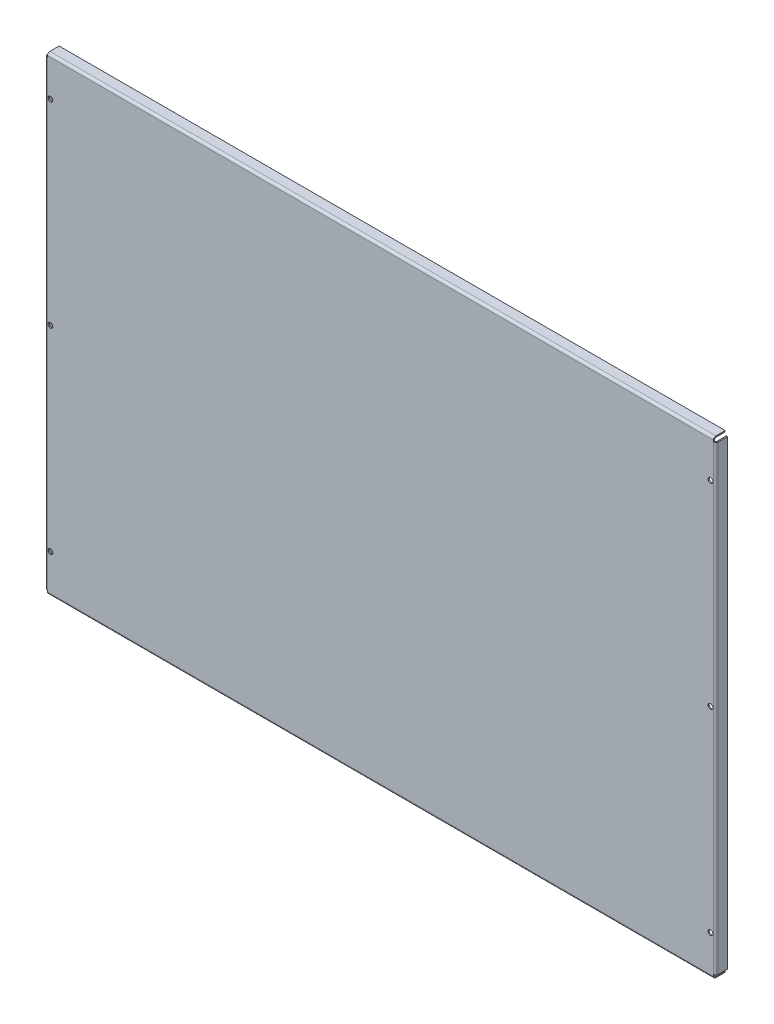
ISO-10303-21;
HEADER;
FILE_DESCRIPTION(('STEP AP214'),'2;1');
FILE_NAME('part.step','',(''),(''),'','','');
FILE_SCHEMA(('AUTOMOTIVE_DESIGN { 1 0 10303 214 1 1 1 1 }'));
ENDSEC;
DATA;
#1=APPLICATION_CONTEXT('core data for automotive mechanical design processes');
#2=APPLICATION_PROTOCOL_DEFINITION('international standard','automotive_design',2000,#1);
#3=PRODUCT_CONTEXT('',#1,'mechanical');
#4=PRODUCT('Part','Part','',(#3));
#5=PRODUCT_RELATED_PRODUCT_CATEGORY('part','',(#4));
#6=PRODUCT_DEFINITION_FORMATION('','',#4);
#7=PRODUCT_DEFINITION_CONTEXT('part definition',#1,'design');
#8=PRODUCT_DEFINITION('design','',#6,#7);
#9=PRODUCT_DEFINITION_SHAPE('','',#8);
#10=(LENGTH_UNIT() NAMED_UNIT(*) SI_UNIT(.MILLI.,.METRE.));
#11=(NAMED_UNIT(*) PLANE_ANGLE_UNIT() SI_UNIT($,.RADIAN.));
#12=(NAMED_UNIT(*) SI_UNIT($,.STERADIAN.) SOLID_ANGLE_UNIT());
#13=UNCERTAINTY_MEASURE_WITH_UNIT(LENGTH_MEASURE(1.E-05),#10,'distance_accuracy_value','');
#14=(GEOMETRIC_REPRESENTATION_CONTEXT(3) GLOBAL_UNCERTAINTY_ASSIGNED_CONTEXT((#13)) GLOBAL_UNIT_ASSIGNED_CONTEXT((#10,
#11,#12)) REPRESENTATION_CONTEXT('',''));
#15=CARTESIAN_POINT('',(0.,0.,0.));
#16=DIRECTION('',(0.,0.,1.));
#17=DIRECTION('',(1.,0.,0.));
#18=AXIS2_PLACEMENT_3D('',#15,#16,#17);
#19=CARTESIAN_POINT('',(539.877,380.238,-134.62));
#20=DIRECTION('',(-1.,0.,0.));
#21=DIRECTION('',(0.,0.,1.));
#22=AXIS2_PLACEMENT_3D('',#19,#20,#21);
#23=PLANE('',#22);
#24=DIRECTION('',(0.,0.,1.));
#25=VECTOR('',#24,1.);
#26=CARTESIAN_POINT('',(539.877,380.238,-134.62));
#27=LINE('',#26,#25);
#28=CARTESIAN_POINT('',(539.877,380.238,-19.05));
#29=VERTEX_POINT('',#28);
#30=CARTESIAN_POINT('',(539.877,380.238,-3.81000000000001));
#31=VERTEX_POINT('',#30);
#32=EDGE_CURVE('E643',#29,#31,#27,.T.);
#33=ORIENTED_EDGE('',*,*,#32,.T.);
#34=DIRECTION('',(0.,-1.,0.));
#35=VECTOR('',#34,1.);
#36=CARTESIAN_POINT('',(539.877,380.238,-3.81000000000001));
#37=LINE('',#36,#35);
#38=CARTESIAN_POINT('',(539.877,378.333,-3.81000000000001));
#39=VERTEX_POINT('',#38);
#40=EDGE_CURVE('E13',#31,#39,#37,.T.);
#41=ORIENTED_EDGE('',*,*,#40,.T.);
#42=DIRECTION('',(0.,0.,-1.));
#43=VECTOR('',#42,1.);
#44=CARTESIAN_POINT('',(539.877,378.333,1.23111397619545E-12));
#45=LINE('',#44,#43);
#46=CARTESIAN_POINT('',(539.877,378.333,-19.05));
#47=VERTEX_POINT('',#46);
#48=EDGE_CURVE('E147',#39,#47,#45,.T.);
#49=ORIENTED_EDGE('',*,*,#48,.T.);
#50=DIRECTION('',(0.,1.,0.));
#51=VECTOR('',#50,1.);
#52=CARTESIAN_POINT('',(539.877,380.238,-19.05));
#53=LINE('',#52,#51);
#54=EDGE_CURVE('E350',#47,#29,#53,.T.);
#55=ORIENTED_EDGE('',*,*,#54,.T.);
#56=EDGE_LOOP('',(#33,#41,#49,#55));
#57=FACE_BOUND('',#56,.T.);
#58=ADVANCED_FACE('F132',(#57),#23,.F.);
#59=CARTESIAN_POINT('',(-543.687,373.888,-134.62));
#60=DIRECTION('',(0.,-1.,0.));
#61=DIRECTION('',(0.,0.,-1.));
#62=AXIS2_PLACEMENT_3D('',#59,#60,#61);
#63=PLANE('',#62);
#64=DIRECTION('',(0.,0.,1.));
#65=VECTOR('',#64,1.);
#66=CARTESIAN_POINT('',(-543.687,373.888,-134.62));
#67=LINE('',#66,#65);
#68=CARTESIAN_POINT('',(-543.687,373.888,-19.05));
#69=VERTEX_POINT('',#68);
#70=CARTESIAN_POINT('',(-543.687,373.888,-3.81000000000009));
#71=VERTEX_POINT('',#70);
#72=EDGE_CURVE('E372',#69,#71,#67,.T.);
#73=ORIENTED_EDGE('',*,*,#72,.T.);
#74=DIRECTION('',(1.,0.,0.));
#75=VECTOR('',#74,1.);
#76=CARTESIAN_POINT('',(-543.687,373.888,-3.81000000000009));
#77=LINE('',#76,#75);
#78=CARTESIAN_POINT('',(-541.782,373.888,-3.81000000000009));
#79=VERTEX_POINT('',#78);
#80=EDGE_CURVE('E141',#71,#79,#77,.T.);
#81=ORIENTED_EDGE('',*,*,#80,.T.);
#82=DIRECTION('',(0.,0.,-1.));
#83=VECTOR('',#82,1.);
#84=CARTESIAN_POINT('',(-541.782,373.888,3.52064056920022E-12));
#85=LINE('',#84,#83);
#86=CARTESIAN_POINT('',(-541.782,373.888,-19.05));
#87=VERTEX_POINT('',#86);
#88=EDGE_CURVE('E155',#79,#87,#85,.T.);
#89=ORIENTED_EDGE('',*,*,#88,.T.);
#90=DIRECTION('',(-1.,0.,0.));
#91=VECTOR('',#90,1.);
#92=CARTESIAN_POINT('',(-543.687,373.888,-19.05));
#93=LINE('',#92,#91);
#94=EDGE_CURVE('E347',#87,#69,#93,.T.);
#95=ORIENTED_EDGE('',*,*,#94,.T.);
#96=EDGE_LOOP('',(#73,#81,#89,#95));
#97=FACE_BOUND('',#96,.T.);
#98=ADVANCED_FACE('F370',(#97),#63,.F.);
#99=CARTESIAN_POINT('',(-539.877,380.238,-134.62));
#100=DIRECTION('',(1.,0.,0.));
#101=DIRECTION('',(0.,0.,-1.));
#102=AXIS2_PLACEMENT_3D('',#99,#100,#101);
#103=PLANE('',#102);
#104=DIRECTION('',(0.,0.,1.));
#105=VECTOR('',#104,1.);
#106=CARTESIAN_POINT('',(-539.877,378.333,1.23111397619545E-12));
#107=LINE('',#106,#105);
#108=CARTESIAN_POINT('',(-539.877,378.333,-19.05));
#109=VERTEX_POINT('',#108);
#110=CARTESIAN_POINT('',(-539.877,378.333,-3.81000000000001));
#111=VERTEX_POINT('',#110);
#112=EDGE_CURVE('E588',#109,#111,#107,.T.);
#113=ORIENTED_EDGE('',*,*,#112,.T.);
#114=DIRECTION('',(-1.16558847729676E-13,1.,0.));
#115=VECTOR('',#114,1.);
#116=CARTESIAN_POINT('',(-539.877,378.333,-3.81000000000001));
#117=LINE('',#116,#115);
#118=CARTESIAN_POINT('',(-539.877,380.238,-3.81000000000001));
#119=VERTEX_POINT('',#118);
#120=EDGE_CURVE('E364',#111,#119,#117,.T.);
#121=ORIENTED_EDGE('',*,*,#120,.T.);
#122=DIRECTION('',(0.,0.,1.));
#123=VECTOR('',#122,1.);
#124=CARTESIAN_POINT('',(-539.877,380.238,-134.62));
#125=LINE('',#124,#123);
#126=CARTESIAN_POINT('',(-539.877,380.238,-19.05));
#127=VERTEX_POINT('',#126);
#128=EDGE_CURVE('E654',#127,#119,#125,.T.);
#129=ORIENTED_EDGE('',*,*,#128,.F.);
#130=DIRECTION('',(0.,-1.,0.));
#131=VECTOR('',#130,1.);
#132=CARTESIAN_POINT('',(-539.877,380.238,-19.05));
#133=LINE('',#132,#131);
#134=EDGE_CURVE('E592',#127,#109,#133,.T.);
#135=ORIENTED_EDGE('',*,*,#134,.T.);
#136=EDGE_LOOP('',(#113,#121,#129,#135));
#137=FACE_BOUND('',#136,.T.);
#138=ADVANCED_FACE('F791',(#137),#103,.F.);
#139=CARTESIAN_POINT('',(-539.877,-373.888,-134.62));
#140=DIRECTION('',(1.,0.,0.));
#141=DIRECTION('',(0.,0.,-1.));
#142=AXIS2_PLACEMENT_3D('',#139,#140,#141);
#143=PLANE('',#142);
#144=DIRECTION('',(0.,0.,1.));
#145=VECTOR('',#144,1.);
#146=CARTESIAN_POINT('',(-539.877,-380.238,-134.62));
#147=LINE('',#146,#145);
#148=CARTESIAN_POINT('',(-539.877,-380.238,-19.05));
#149=VERTEX_POINT('',#148);
#150=CARTESIAN_POINT('',(-539.877,-380.238,-3.80999999999998));
#151=VERTEX_POINT('',#150);
#152=EDGE_CURVE('E686',#149,#151,#147,.T.);
#153=ORIENTED_EDGE('',*,*,#152,.T.);
#154=DIRECTION('',(0.,1.,0.));
#155=VECTOR('',#154,1.);
#156=CARTESIAN_POINT('',(-539.877,-380.238,-3.80999999999998));
#157=LINE('',#156,#155);
#158=CARTESIAN_POINT('',(-539.877,-378.333,-3.80999999999998));
#159=VERTEX_POINT('',#158);
#160=EDGE_CURVE('E361',#151,#159,#157,.T.);
#161=ORIENTED_EDGE('',*,*,#160,.T.);
#162=DIRECTION('',(0.,0.,-1.));
#163=VECTOR('',#162,1.);
#164=CARTESIAN_POINT('',(-539.877,-378.333,1.23111397619545E-12));
#165=LINE('',#164,#163);
#166=CARTESIAN_POINT('',(-539.877,-378.333,-19.05));
#167=VERTEX_POINT('',#166);
#168=EDGE_CURVE('E711',#159,#167,#165,.T.);
#169=ORIENTED_EDGE('',*,*,#168,.T.);
#170=DIRECTION('',(0.,-1.,0.));
#171=VECTOR('',#170,1.);
#172=CARTESIAN_POINT('',(-539.877,-380.238,-19.05));
#173=LINE('',#172,#171);
#174=EDGE_CURVE('E337',#167,#149,#173,.T.);
#175=ORIENTED_EDGE('',*,*,#174,.T.);
#176=EDGE_LOOP('',(#153,#161,#169,#175));
#177=FACE_BOUND('',#176,.T.);
#178=ADVANCED_FACE('F773',(#177),#143,.F.);
#179=CARTESIAN_POINT('',(539.877,-373.888,-134.62));
#180=DIRECTION('',(0.,1.,0.));
#181=DIRECTION('',(0.,0.,1.));
#182=AXIS2_PLACEMENT_3D('',#179,#180,#181);
#183=PLANE('',#182);
#184=DIRECTION('',(0.,0.,1.));
#185=VECTOR('',#184,1.);
#186=CARTESIAN_POINT('',(543.687,-373.888,-134.62));
#187=LINE('',#186,#185);
#188=CARTESIAN_POINT('',(543.687,-373.888,-19.05));
#189=VERTEX_POINT('',#188);
#190=CARTESIAN_POINT('',(543.687,-373.888,-3.81000000000009));
#191=VERTEX_POINT('',#190);
#192=EDGE_CURVE('E317',#189,#191,#187,.T.);
#193=ORIENTED_EDGE('',*,*,#192,.T.);
#194=DIRECTION('',(-1.,0.,0.));
#195=VECTOR('',#194,1.);
#196=CARTESIAN_POINT('',(543.687,-373.888,-3.81000000000009));
#197=LINE('',#196,#195);
#198=CARTESIAN_POINT('',(541.782,-373.888,-3.81000000000009));
#199=VERTEX_POINT('',#198);
#200=EDGE_CURVE('E299',#191,#199,#197,.T.);
#201=ORIENTED_EDGE('',*,*,#200,.T.);
#202=DIRECTION('',(0.,0.,1.));
#203=VECTOR('',#202,1.);
#204=CARTESIAN_POINT('',(541.782,-373.888,0.));
#205=LINE('',#204,#203);
#206=CARTESIAN_POINT('',(541.782,-373.888,-19.05));
#207=VERTEX_POINT('',#206);
#208=EDGE_CURVE('E473',#207,#199,#205,.T.);
#209=ORIENTED_EDGE('',*,*,#208,.F.);
#210=DIRECTION('',(1.,0.,0.));
#211=VECTOR('',#210,1.);
#212=CARTESIAN_POINT('',(543.687,-373.888,-19.05));
#213=LINE('',#212,#211);
#214=EDGE_CURVE('E353',#207,#189,#213,.T.);
#215=ORIENTED_EDGE('',*,*,#214,.T.);
#216=EDGE_LOOP('',(#193,#201,#209,#215));
#217=FACE_BOUND('',#216,.T.);
#218=ADVANCED_FACE('F783',(#217),#183,.F.);
#219=CARTESIAN_POINT('',(0.,0.,-1.905));
#220=DIRECTION('',(0.,0.,1.));
#221=DIRECTION('',(1.,0.,0.));
#222=AXIS2_PLACEMENT_3D('',#219,#220,#221);
#223=PLANE('',#222);
#224=CARTESIAN_POINT('',(-535.051,0.,-1.90499999999999));
#225=DIRECTION('',(0.,0.,1.));
#226=DIRECTION('',(1.,0.,0.));
#227=AXIS2_PLACEMENT_3D('',#224,#225,#226);
#228=CIRCLE('',#227,3.93699999999994);
#229=CARTESIAN_POINT('',(-531.114,0.,-1.90499999999999));
#230=VERTEX_POINT('',#229);
#231=EDGE_CURVE('E513',#230,#230,#228,.T.);
#232=ORIENTED_EDGE('',*,*,#231,.T.);
#233=EDGE_LOOP('',(#232));
#234=FACE_BOUND('',#233,.T.);
#235=CARTESIAN_POINT('',(535.051,1.11022302462516E-13,-1.90499999999999));
#236=DIRECTION('',(0.,0.,1.));
#237=DIRECTION('',(1.,0.,0.));
#238=AXIS2_PLACEMENT_3D('',#235,#236,#237);
#239=CIRCLE('',#238,3.96240000000001);
#240=CARTESIAN_POINT('',(539.0134,1.11022302462516E-13,-1.90499999999999));
#241=VERTEX_POINT('',#240);
#242=EDGE_CURVE('E509',#241,#241,#239,.T.);
#243=ORIENTED_EDGE('',*,*,#242,.T.);
#244=EDGE_LOOP('',(#243));
#245=FACE_BOUND('',#244,.T.);
#246=CARTESIAN_POINT('',(-535.051,-317.5,-1.90499999999999));
#247=DIRECTION('',(0.,0.,1.));
#248=DIRECTION('',(1.,0.,0.));
#249=AXIS2_PLACEMENT_3D('',#246,#247,#248);
#250=CIRCLE('',#249,3.93699999999994);
#251=CARTESIAN_POINT('',(-531.114,-317.5,-1.90499999999999));
#252=VERTEX_POINT('',#251);
#253=EDGE_CURVE('E505',#252,#252,#250,.T.);
#254=ORIENTED_EDGE('',*,*,#253,.T.);
#255=EDGE_LOOP('',(#254));
#256=FACE_BOUND('',#255,.T.);
#257=CARTESIAN_POINT('',(535.051,-317.5,-1.90499999999999));
#258=DIRECTION('',(0.,0.,1.));
#259=DIRECTION('',(1.,0.,0.));
#260=AXIS2_PLACEMENT_3D('',#257,#258,#259);
#261=CIRCLE('',#260,3.93699999999994);
#262=CARTESIAN_POINT('',(538.988,-317.5,-1.90499999999999));
#263=VERTEX_POINT('',#262);
#264=EDGE_CURVE('E501',#263,#263,#261,.T.);
#265=ORIENTED_EDGE('',*,*,#264,.T.);
#266=EDGE_LOOP('',(#265));
#267=FACE_BOUND('',#266,.T.);
#268=CARTESIAN_POINT('',(535.051,317.5,-1.90499999999999));
#269=DIRECTION('',(0.,0.,1.));
#270=DIRECTION('',(1.,0.,0.));
#271=AXIS2_PLACEMENT_3D('',#268,#269,#270);
#272=CIRCLE('',#271,3.93699999999994);
#273=CARTESIAN_POINT('',(538.988,317.5,-1.90499999999999));
#274=VERTEX_POINT('',#273);
#275=EDGE_CURVE('E497',#274,#274,#272,.T.);
#276=ORIENTED_EDGE('',*,*,#275,.T.);
#277=EDGE_LOOP('',(#276));
#278=FACE_BOUND('',#277,.T.);
#279=CARTESIAN_POINT('',(-535.051,317.5,-1.90499999999999));
#280=DIRECTION('',(0.,0.,1.));
#281=DIRECTION('',(1.,0.,0.));
#282=AXIS2_PLACEMENT_3D('',#279,#280,#281);
#283=CIRCLE('',#282,3.9624);
#284=CARTESIAN_POINT('',(-531.0886,317.5,-1.90499999999999));
#285=VERTEX_POINT('',#284);
#286=EDGE_CURVE('E493',#285,#285,#283,.T.);
#287=ORIENTED_EDGE('',*,*,#286,.T.);
#288=EDGE_LOOP('',(#287));
#289=FACE_BOUND('',#288,.T.);
#290=DIRECTION('',(-1.,0.,0.));
#291=VECTOR('',#290,1.);
#292=CARTESIAN_POINT('',(-541.074893218813,-376.428,-1.905));
#293=LINE('',#292,#291);
#294=CARTESIAN_POINT('',(-539.877,-376.428,-1.905));
#295=VERTEX_POINT('',#294);
#296=CARTESIAN_POINT('',(539.877,-376.428,-1.905));
#297=VERTEX_POINT('',#296);
#298=EDGE_CURVE('E410',#295,#297,#293,.F.);
#299=ORIENTED_EDGE('',*,*,#298,.F.);
#300=DIRECTION('',(0.,1.,0.));
#301=VECTOR('',#300,1.);
#302=CARTESIAN_POINT('',(-539.877,0.,-1.905));
#303=LINE('',#302,#301);
#304=CARTESIAN_POINT('',(-539.877,-373.888,-1.90500000000016));
#305=VERTEX_POINT('',#304);
#306=EDGE_CURVE('E722',#295,#305,#303,.T.);
#307=ORIENTED_EDGE('',*,*,#306,.T.);
#308=DIRECTION('',(0.,1.,0.));
#309=VECTOR('',#308,1.);
#310=CARTESIAN_POINT('',(-539.877,377.625893218813,-1.90500000000017));
#311=LINE('',#310,#309);
#312=CARTESIAN_POINT('',(-539.877,373.888,-1.90500000000017));
#313=VERTEX_POINT('',#312);
#314=EDGE_CURVE('E418',#313,#305,#311,.F.);
#315=ORIENTED_EDGE('',*,*,#314,.F.);
#316=CARTESIAN_POINT('',(-539.877,376.428,-1.90500000000017));
#317=VERTEX_POINT('',#316);
#318=EDGE_CURVE('E414',#317,#313,#311,.F.);
#319=ORIENTED_EDGE('',*,*,#318,.F.);
#320=DIRECTION('',(1.,0.,0.));
#321=VECTOR('',#320,1.);
#322=CARTESIAN_POINT('',(541.074893218813,376.428,-1.90500000000002));
#323=LINE('',#322,#321);
#324=CARTESIAN_POINT('',(539.877,376.428,-1.90500000000002));
#325=VERTEX_POINT('',#324);
#326=EDGE_CURVE('E427',#325,#317,#323,.F.);
#327=ORIENTED_EDGE('',*,*,#326,.F.);
#328=DIRECTION('',(0.,-1.,0.));
#329=VECTOR('',#328,1.);
#330=CARTESIAN_POINT('',(539.877,0.,-1.905));
#331=LINE('',#330,#329);
#332=CARTESIAN_POINT('',(539.877,373.888,-1.90500000000005));
#333=VERTEX_POINT('',#332);
#334=EDGE_CURVE('E483',#325,#333,#331,.T.);
#335=ORIENTED_EDGE('',*,*,#334,.T.);
#336=DIRECTION('',(0.,-1.,0.));
#337=VECTOR('',#336,1.);
#338=CARTESIAN_POINT('',(539.877,-377.625893218813,-1.90500000000005));
#339=LINE('',#338,#337);
#340=CARTESIAN_POINT('',(539.877,-373.888,-1.90500000000005));
#341=VERTEX_POINT('',#340);
#342=EDGE_CURVE('E451',#341,#333,#339,.F.);
#343=ORIENTED_EDGE('',*,*,#342,.F.);
#344=EDGE_CURVE('E315',#297,#341,#339,.F.);
#345=ORIENTED_EDGE('',*,*,#344,.F.);
#346=EDGE_LOOP('',(#299,#307,#315,#319,#327,#335,#343,#345));
#347=FACE_BOUND('',#346,.T.);
#348=ADVANCED_FACE('F610',(#234,#245,#256,#267,#278,#289,#347),#223,.F.);
#349=CARTESIAN_POINT('',(0.,0.,0.));
#350=DIRECTION('',(0.,0.,1.));
#351=DIRECTION('',(1.,0.,0.));
#352=AXIS2_PLACEMENT_3D('',#349,#350,#351);
#353=PLANE('',#352);
#354=CARTESIAN_POINT('',(-535.051,0.,0.));
#355=DIRECTION('',(0.,0.,1.));
#356=DIRECTION('',(1.,0.,0.));
#357=AXIS2_PLACEMENT_3D('',#354,#355,#356);
#358=CIRCLE('',#357,3.93699999999994);
#359=CARTESIAN_POINT('',(-531.114,0.,0.));
#360=VERTEX_POINT('',#359);
#361=EDGE_CURVE('E668',#360,#360,#358,.T.);
#362=ORIENTED_EDGE('',*,*,#361,.F.);
#363=EDGE_LOOP('',(#362));
#364=FACE_BOUND('',#363,.T.);
#365=CARTESIAN_POINT('',(535.051,1.11022302462516E-13,0.));
#366=DIRECTION('',(0.,0.,1.));
#367=DIRECTION('',(1.,0.,0.));
#368=AXIS2_PLACEMENT_3D('',#365,#366,#367);
#369=CIRCLE('',#368,3.96240000000001);
#370=CARTESIAN_POINT('',(539.0134,1.11022302462516E-13,0.));
#371=VERTEX_POINT('',#370);
#372=EDGE_CURVE('E663',#371,#371,#369,.T.);
#373=ORIENTED_EDGE('',*,*,#372,.F.);
#374=EDGE_LOOP('',(#373));
#375=FACE_BOUND('',#374,.T.);
#376=CARTESIAN_POINT('',(-535.051,-317.5,0.));
#377=DIRECTION('',(0.,0.,1.));
#378=DIRECTION('',(1.,0.,0.));
#379=AXIS2_PLACEMENT_3D('',#376,#377,#378);
#380=CIRCLE('',#379,3.93699999999994);
#381=CARTESIAN_POINT('',(-531.114,-317.5,0.));
#382=VERTEX_POINT('',#381);
#383=EDGE_CURVE('E682',#382,#382,#380,.T.);
#384=ORIENTED_EDGE('',*,*,#383,.F.);
#385=EDGE_LOOP('',(#384));
#386=FACE_BOUND('',#385,.T.);
#387=CARTESIAN_POINT('',(535.051,-317.5,0.));
#388=DIRECTION('',(0.,0.,1.));
#389=DIRECTION('',(1.,0.,0.));
#390=AXIS2_PLACEMENT_3D('',#387,#388,#389);
#391=CIRCLE('',#390,3.93699999999994);
#392=CARTESIAN_POINT('',(538.988,-317.5,0.));
#393=VERTEX_POINT('',#392);
#394=EDGE_CURVE('E678',#393,#393,#391,.T.);
#395=ORIENTED_EDGE('',*,*,#394,.F.);
#396=EDGE_LOOP('',(#395));
#397=FACE_BOUND('',#396,.T.);
#398=CARTESIAN_POINT('',(535.051,317.5,0.));
#399=DIRECTION('',(0.,0.,1.));
#400=DIRECTION('',(1.,0.,0.));
#401=AXIS2_PLACEMENT_3D('',#398,#399,#400);
#402=CIRCLE('',#401,3.93699999999994);
#403=CARTESIAN_POINT('',(538.988,317.5,0.));
#404=VERTEX_POINT('',#403);
#405=EDGE_CURVE('E673',#404,#404,#402,.T.);
#406=ORIENTED_EDGE('',*,*,#405,.F.);
#407=EDGE_LOOP('',(#406));
#408=FACE_BOUND('',#407,.T.);
#409=CARTESIAN_POINT('',(-535.051,317.5,0.));
#410=DIRECTION('',(0.,0.,1.));
#411=DIRECTION('',(1.,0.,0.));
#412=AXIS2_PLACEMENT_3D('',#409,#410,#411);
#413=CIRCLE('',#412,3.9624);
#414=CARTESIAN_POINT('',(-531.0886,317.5,0.));
#415=VERTEX_POINT('',#414);
#416=EDGE_CURVE('E677',#415,#415,#413,.T.);
#417=ORIENTED_EDGE('',*,*,#416,.F.);
#418=EDGE_LOOP('',(#417));
#419=FACE_BOUND('',#418,.T.);
#420=DIRECTION('',(0.,1.,0.));
#421=VECTOR('',#420,1.);
#422=CARTESIAN_POINT('',(-539.877,377.625893218813,-1.70002900645727E-13));
#423=LINE('',#422,#421);
#424=CARTESIAN_POINT('',(-539.877,376.428,0.));
#425=VERTEX_POINT('',#424);
#426=CARTESIAN_POINT('',(-539.877,373.888,0.));
#427=VERTEX_POINT('',#426);
#428=EDGE_CURVE('E419',#425,#427,#423,.F.);
#429=ORIENTED_EDGE('',*,*,#428,.T.);
#430=CARTESIAN_POINT('',(-539.877,-373.888,0.));
#431=VERTEX_POINT('',#430);
#432=EDGE_CURVE('E417',#427,#431,#423,.F.);
#433=ORIENTED_EDGE('',*,*,#432,.T.);
#434=DIRECTION('',(0.,1.,0.));
#435=VECTOR('',#434,1.);
#436=CARTESIAN_POINT('',(-539.877,-373.888,0.));
#437=LINE('',#436,#435);
#438=CARTESIAN_POINT('',(-539.877,-376.428,0.));
#439=VERTEX_POINT('',#438);
#440=EDGE_CURVE('E558',#439,#431,#437,.T.);
#441=ORIENTED_EDGE('',*,*,#440,.F.);
#442=DIRECTION('',(-1.,0.,0.));
#443=VECTOR('',#442,1.);
#444=CARTESIAN_POINT('',(-541.074893218813,-376.428,0.));
#445=LINE('',#444,#443);
#446=CARTESIAN_POINT('',(539.877,-376.428,0.));
#447=VERTEX_POINT('',#446);
#448=EDGE_CURVE('E332',#439,#447,#445,.F.);
#449=ORIENTED_EDGE('',*,*,#448,.T.);
#450=DIRECTION('',(0.,-1.,0.));
#451=VECTOR('',#450,1.);
#452=CARTESIAN_POINT('',(539.877,-377.625893218813,0.));
#453=LINE('',#452,#451);
#454=CARTESIAN_POINT('',(539.877,-373.888,0.));
#455=VERTEX_POINT('',#454);
#456=EDGE_CURVE('E312',#447,#455,#453,.F.);
#457=ORIENTED_EDGE('',*,*,#456,.T.);
#458=CARTESIAN_POINT('',(539.877,373.888,0.));
#459=VERTEX_POINT('',#458);
#460=EDGE_CURVE('E321',#455,#459,#453,.F.);
#461=ORIENTED_EDGE('',*,*,#460,.T.);
#462=DIRECTION('',(0.,-1.,0.));
#463=VECTOR('',#462,1.);
#464=CARTESIAN_POINT('',(539.877,380.238,0.));
#465=LINE('',#464,#463);
#466=CARTESIAN_POINT('',(539.877,376.428,0.));
#467=VERTEX_POINT('',#466);
#468=EDGE_CURVE('E649',#467,#459,#465,.T.);
#469=ORIENTED_EDGE('',*,*,#468,.F.);
#470=DIRECTION('',(1.,0.,0.));
#471=VECTOR('',#470,1.);
#472=CARTESIAN_POINT('',(541.074893218813,376.428,0.));
#473=LINE('',#472,#471);
#474=EDGE_CURVE('E442',#467,#425,#473,.F.);
#475=ORIENTED_EDGE('',*,*,#474,.T.);
#476=EDGE_LOOP('',(#429,#433,#441,#449,#457,#461,#469,#475));
#477=FACE_BOUND('',#476,.T.);
#478=ADVANCED_FACE('F134',(#364,#375,#386,#397,#408,#419,#477),#353,.T.);
#479=CARTESIAN_POINT('',(539.877,-377.625893218813,-3.81000000000009));
#480=DIRECTION('',(0.,-1.,0.));
#481=DIRECTION('',(1.,0.,0.));
#482=AXIS2_PLACEMENT_3D('',#479,#480,#481);
#483=CYLINDRICAL_SURFACE('',#482,3.81000000000004);
#484=CARTESIAN_POINT('',(539.877,373.888,-3.81000000000009));
#485=DIRECTION('',(0.,-1.,0.));
#486=DIRECTION('',(0.,0.,-1.));
#487=AXIS2_PLACEMENT_3D('',#484,#485,#486);
#488=CIRCLE('',#487,3.81000000000004);
#489=CARTESIAN_POINT('',(543.687,373.888,-3.81000000000009));
#490=VERTEX_POINT('',#489);
#491=EDGE_CURVE('E323',#459,#490,#488,.F.);
#492=ORIENTED_EDGE('',*,*,#491,.F.);
#493=ORIENTED_EDGE('',*,*,#460,.F.);
#494=CARTESIAN_POINT('',(539.877,-373.888,-3.81000000000009));
#495=DIRECTION('',(0.,1.,0.));
#496=DIRECTION('',(0.,0.,1.));
#497=AXIS2_PLACEMENT_3D('',#494,#495,#496);
#498=CIRCLE('',#497,3.81000000000004);
#499=EDGE_CURVE('E293',#191,#455,#498,.F.);
#500=ORIENTED_EDGE('',*,*,#499,.F.);
#501=DIRECTION('',(0.,-1.,0.));
#502=VECTOR('',#501,1.);
#503=CARTESIAN_POINT('',(543.687,0.,-3.81000000000009));
#504=LINE('',#503,#502);
#505=EDGE_CURVE('E456',#490,#191,#504,.T.);
#506=ORIENTED_EDGE('',*,*,#505,.F.);
#507=EDGE_LOOP('',(#492,#493,#500,#506));
#508=FACE_BOUND('',#507,.T.);
#509=ADVANCED_FACE('F322',(#508),#483,.T.);
#510=CARTESIAN_POINT('',(539.877,-377.625893218813,-3.81000000000009));
#511=DIRECTION('',(0.,-1.,0.));
#512=DIRECTION('',(1.,0.,0.));
#513=AXIS2_PLACEMENT_3D('',#510,#511,#512);
#514=CYLINDRICAL_SURFACE('',#513,1.90500000000005);
#515=ORIENTED_EDGE('',*,*,#342,.T.);
#516=CARTESIAN_POINT('',(539.877,373.888,-3.81000000000009));
#517=DIRECTION('',(0.,-1.,0.));
#518=DIRECTION('',(0.,0.,-1.));
#519=AXIS2_PLACEMENT_3D('',#516,#517,#518);
#520=CIRCLE('',#519,1.90500000000005);
#521=CARTESIAN_POINT('',(541.782,373.888,-3.81000000000009));
#522=VERTEX_POINT('',#521);
#523=EDGE_CURVE('E467',#333,#522,#520,.F.);
#524=ORIENTED_EDGE('',*,*,#523,.T.);
#525=DIRECTION('',(0.,1.,0.));
#526=VECTOR('',#525,1.);
#527=CARTESIAN_POINT('',(541.782,380.238,-3.81000000000009));
#528=LINE('',#527,#526);
#529=EDGE_CURVE('E446',#522,#199,#528,.F.);
#530=ORIENTED_EDGE('',*,*,#529,.T.);
#531=CARTESIAN_POINT('',(539.877,-373.888,-3.81000000000009));
#532=DIRECTION('',(0.,1.,0.));
#533=DIRECTION('',(0.,0.,1.));
#534=AXIS2_PLACEMENT_3D('',#531,#532,#533);
#535=CIRCLE('',#534,1.90500000000005);
#536=EDGE_CURVE('E307',#199,#341,#535,.F.);
#537=ORIENTED_EDGE('',*,*,#536,.T.);
#538=EDGE_LOOP('',(#515,#524,#530,#537));
#539=FACE_BOUND('',#538,.T.);
#540=ADVANCED_FACE('F465',(#539),#514,.F.);
#541=CARTESIAN_POINT('',(543.687,0.,0.));
#542=DIRECTION('',(1.,0.,0.));
#543=DIRECTION('',(0.,1.,0.));
#544=AXIS2_PLACEMENT_3D('',#541,#542,#543);
#545=PLANE('',#544);
#546=DIRECTION('',(0.,0.,1.));
#547=VECTOR('',#546,1.);
#548=CARTESIAN_POINT('',(543.687,373.888,-134.62));
#549=LINE('',#548,#547);
#550=CARTESIAN_POINT('',(543.687,373.888,-19.05));
#551=VERTEX_POINT('',#550);
#552=EDGE_CURVE('E656',#551,#490,#549,.T.);
#553=ORIENTED_EDGE('',*,*,#552,.T.);
#554=ORIENTED_EDGE('',*,*,#505,.T.);
#555=ORIENTED_EDGE('',*,*,#192,.F.);
#556=DIRECTION('',(0.,-1.,0.));
#557=VECTOR('',#556,1.);
#558=CARTESIAN_POINT('',(543.687,-380.238,-19.05));
#559=LINE('',#558,#557);
#560=EDGE_CURVE('E447',#551,#189,#559,.T.);
#561=ORIENTED_EDGE('',*,*,#560,.F.);
#562=EDGE_LOOP('',(#553,#554,#555,#561));
#563=FACE_BOUND('',#562,.T.);
#564=ADVANCED_FACE('F847',(#563),#545,.T.);
#565=CARTESIAN_POINT('',(541.782,0.,0.));
#566=DIRECTION('',(1.,0.,0.));
#567=DIRECTION('',(0.,1.,0.));
#568=AXIS2_PLACEMENT_3D('',#565,#566,#567);
#569=PLANE('',#568);
#570=ORIENTED_EDGE('',*,*,#529,.F.);
#571=DIRECTION('',(0.,0.,-1.));
#572=VECTOR('',#571,1.);
#573=CARTESIAN_POINT('',(541.782,373.888,0.));
#574=LINE('',#573,#572);
#575=CARTESIAN_POINT('',(541.782,373.888,-19.05));
#576=VERTEX_POINT('',#575);
#577=EDGE_CURVE('E306',#522,#576,#574,.T.);
#578=ORIENTED_EDGE('',*,*,#577,.T.);
#579=DIRECTION('',(0.,1.,0.));
#580=VECTOR('',#579,1.);
#581=CARTESIAN_POINT('',(541.782,0.,-19.05));
#582=LINE('',#581,#580);
#583=EDGE_CURVE('E452',#576,#207,#582,.F.);
#584=ORIENTED_EDGE('',*,*,#583,.T.);
#585=ORIENTED_EDGE('',*,*,#208,.T.);
#586=EDGE_LOOP('',(#570,#578,#584,#585));
#587=FACE_BOUND('',#586,.T.);
#588=ADVANCED_FACE('F471',(#587),#569,.F.);
#589=CARTESIAN_POINT('',(543.687,-380.238,-19.05));
#590=DIRECTION('',(0.,0.,-1.));
#591=DIRECTION('',(-1.,0.,0.));
#592=AXIS2_PLACEMENT_3D('',#589,#590,#591);
#593=PLANE('',#592);
#594=DIRECTION('',(-1.,0.,0.));
#595=VECTOR('',#594,1.);
#596=CARTESIAN_POINT('',(543.687,373.888,-19.05));
#597=LINE('',#596,#595);
#598=EDGE_CURVE('E356',#551,#576,#597,.T.);
#599=ORIENTED_EDGE('',*,*,#598,.F.);
#600=ORIENTED_EDGE('',*,*,#560,.T.);
#601=ORIENTED_EDGE('',*,*,#214,.F.);
#602=ORIENTED_EDGE('',*,*,#583,.F.);
#603=EDGE_LOOP('',(#599,#600,#601,#602));
#604=FACE_BOUND('',#603,.T.);
#605=ADVANCED_FACE('F843',(#604),#593,.T.);
#606=CARTESIAN_POINT('',(541.074893218813,376.428,-3.81000000000001));
#607=DIRECTION('',(1.,0.,0.));
#608=DIRECTION('',(0.,1.,0.));
#609=AXIS2_PLACEMENT_3D('',#606,#607,#608);
#610=CYLINDRICAL_SURFACE('',#609,3.80999999999999);
#611=CARTESIAN_POINT('',(539.877,376.428,-3.81000000000001));
#612=DIRECTION('',(-1.,0.,0.));
#613=DIRECTION('',(0.,0.,1.));
#614=AXIS2_PLACEMENT_3D('',#611,#612,#613);
#615=CIRCLE('',#614,3.80999999999999);
#616=EDGE_CURVE('E477',#31,#467,#615,.F.);
#617=ORIENTED_EDGE('',*,*,#616,.F.);
#618=DIRECTION('',(1.,0.,0.));
#619=VECTOR('',#618,1.);
#620=CARTESIAN_POINT('',(-543.687,380.238,-3.80999999999997));
#621=LINE('',#620,#619);
#622=EDGE_CURVE('E432',#31,#119,#621,.F.);
#623=ORIENTED_EDGE('',*,*,#622,.T.);
#624=CARTESIAN_POINT('',(-539.877,376.428,-3.81000000000001));
#625=DIRECTION('',(1.,0.,0.));
#626=DIRECTION('',(0.,0.,-1.));
#627=AXIS2_PLACEMENT_3D('',#624,#625,#626);
#628=CIRCLE('',#627,3.80999999999999);
#629=EDGE_CURVE('E580',#425,#119,#628,.F.);
#630=ORIENTED_EDGE('',*,*,#629,.F.);
#631=ORIENTED_EDGE('',*,*,#474,.F.);
#632=EDGE_LOOP('',(#617,#623,#630,#631));
#633=FACE_BOUND('',#632,.T.);
#634=ADVANCED_FACE('F840',(#633),#610,.T.);
#635=CARTESIAN_POINT('',(541.074893218813,376.428,-3.81000000000001));
#636=DIRECTION('',(1.,0.,0.));
#637=DIRECTION('',(0.,1.,0.));
#638=AXIS2_PLACEMENT_3D('',#635,#636,#637);
#639=CYLINDRICAL_SURFACE('',#638,1.90499999999999);
#640=DIRECTION('',(1.,0.,0.));
#641=VECTOR('',#640,1.);
#642=CARTESIAN_POINT('',(-543.687,378.333,-3.80999999999998));
#643=LINE('',#642,#641);
#644=EDGE_CURVE('E422',#111,#39,#643,.T.);
#645=ORIENTED_EDGE('',*,*,#644,.T.);
#646=CARTESIAN_POINT('',(539.877,376.428,-3.81000000000001));
#647=DIRECTION('',(-1.,0.,0.));
#648=DIRECTION('',(0.,0.,1.));
#649=AXIS2_PLACEMENT_3D('',#646,#647,#648);
#650=CIRCLE('',#649,1.90499999999999);
#651=EDGE_CURVE('E597',#39,#325,#650,.F.);
#652=ORIENTED_EDGE('',*,*,#651,.T.);
#653=ORIENTED_EDGE('',*,*,#326,.T.);
#654=CARTESIAN_POINT('',(-539.877,376.428,-3.81000000000001));
#655=DIRECTION('',(1.,0.,0.));
#656=DIRECTION('',(0.,0.,-1.));
#657=AXIS2_PLACEMENT_3D('',#654,#655,#656);
#658=CIRCLE('',#657,1.90499999999999);
#659=EDGE_CURVE('E584',#317,#111,#658,.F.);
#660=ORIENTED_EDGE('',*,*,#659,.T.);
#661=EDGE_LOOP('',(#645,#652,#653,#660));
#662=FACE_BOUND('',#661,.T.);
#663=ADVANCED_FACE('F631',(#662),#639,.F.);
#664=CARTESIAN_POINT('',(0.,380.238,1.23776524814595E-12));
#665=DIRECTION('',(0.,-1.,0.));
#666=DIRECTION('',(0.,0.,-1.));
#667=AXIS2_PLACEMENT_3D('',#664,#665,#666);
#668=PLANE('',#667);
#669=ORIENTED_EDGE('',*,*,#622,.F.);
#670=ORIENTED_EDGE('',*,*,#32,.F.);
#671=DIRECTION('',(-1.,0.,0.));
#672=VECTOR('',#671,1.);
#673=CARTESIAN_POINT('',(-543.687,380.238,-19.05));
#674=LINE('',#673,#672);
#675=EDGE_CURVE('E423',#127,#29,#674,.F.);
#676=ORIENTED_EDGE('',*,*,#675,.F.);
#677=ORIENTED_EDGE('',*,*,#128,.T.);
#678=EDGE_LOOP('',(#669,#670,#676,#677));
#679=FACE_BOUND('',#678,.T.);
#680=ADVANCED_FACE('F646',(#679),#668,.F.);
#681=CARTESIAN_POINT('',(0.,378.333,1.23111397619545E-12));
#682=DIRECTION('',(0.,-1.,0.));
#683=DIRECTION('',(0.,0.,-1.));
#684=AXIS2_PLACEMENT_3D('',#681,#682,#683);
#685=PLANE('',#684);
#686=ORIENTED_EDGE('',*,*,#48,.F.);
#687=ORIENTED_EDGE('',*,*,#644,.F.);
#688=ORIENTED_EDGE('',*,*,#112,.F.);
#689=DIRECTION('',(1.,0.,0.));
#690=VECTOR('',#689,1.);
#691=CARTESIAN_POINT('',(0.,378.333,-19.05));
#692=LINE('',#691,#690);
#693=EDGE_CURVE('E428',#109,#47,#692,.T.);
#694=ORIENTED_EDGE('',*,*,#693,.T.);
#695=EDGE_LOOP('',(#686,#687,#688,#694));
#696=FACE_BOUND('',#695,.T.);
#697=ADVANCED_FACE('F635',(#696),#685,.T.);
#698=CARTESIAN_POINT('',(-543.687,380.238,-19.05));
#699=DIRECTION('',(0.,0.,-1.));
#700=DIRECTION('',(0.,1.,0.));
#701=AXIS2_PLACEMENT_3D('',#698,#699,#700);
#702=PLANE('',#701);
#703=ORIENTED_EDGE('',*,*,#54,.F.);
#704=ORIENTED_EDGE('',*,*,#693,.F.);
#705=ORIENTED_EDGE('',*,*,#134,.F.);
#706=ORIENTED_EDGE('',*,*,#675,.T.);
#707=EDGE_LOOP('',(#703,#704,#705,#706));
#708=FACE_BOUND('',#707,.T.);
#709=ADVANCED_FACE('F639',(#708),#702,.T.);
#710=CARTESIAN_POINT('',(-539.877,377.625893218813,-3.8100000000001));
#711=DIRECTION('',(0.,1.,0.));
#712=DIRECTION('',(-1.,0.,0.));
#713=AXIS2_PLACEMENT_3D('',#710,#711,#712);
#714=CYLINDRICAL_SURFACE('',#713,3.80999999999993);
#715=CARTESIAN_POINT('',(-539.877,373.888,-3.8100000000001));
#716=DIRECTION('',(0.,-1.,0.));
#717=DIRECTION('',(0.,0.,-1.));
#718=AXIS2_PLACEMENT_3D('',#715,#716,#717);
#719=CIRCLE('',#718,3.80999999999993);
#720=EDGE_CURVE('E386',#71,#427,#719,.F.);
#721=ORIENTED_EDGE('',*,*,#720,.F.);
#722=DIRECTION('',(0.,1.,0.));
#723=VECTOR('',#722,1.);
#724=CARTESIAN_POINT('',(-543.687,-380.238,-3.81000000000008));
#725=LINE('',#724,#723);
#726=CARTESIAN_POINT('',(-543.687,-373.888,-3.81000000000009));
#727=VERTEX_POINT('',#726);
#728=EDGE_CURVE('E403',#71,#727,#725,.F.);
#729=ORIENTED_EDGE('',*,*,#728,.T.);
#730=CARTESIAN_POINT('',(-539.877,-373.888,-3.8100000000001));
#731=DIRECTION('',(0.,1.,0.));
#732=DIRECTION('',(0.,0.,1.));
#733=AXIS2_PLACEMENT_3D('',#730,#731,#732);
#734=CIRCLE('',#733,3.80999999999993);
#735=EDGE_CURVE('E397',#431,#727,#734,.F.);
#736=ORIENTED_EDGE('',*,*,#735,.F.);
#737=ORIENTED_EDGE('',*,*,#432,.F.);
#738=EDGE_LOOP('',(#721,#729,#736,#737));
#739=FACE_BOUND('',#738,.T.);
#740=ADVANCED_FACE('F562',(#739),#714,.T.);
#741=CARTESIAN_POINT('',(-539.877,377.625893218813,-3.8100000000001));
#742=DIRECTION('',(0.,1.,0.));
#743=DIRECTION('',(-1.,0.,0.));
#744=AXIS2_PLACEMENT_3D('',#741,#742,#743);
#745=CYLINDRICAL_SURFACE('',#744,1.90499999999993);
#746=DIRECTION('',(0.,1.,0.));
#747=VECTOR('',#746,1.);
#748=CARTESIAN_POINT('',(-541.782,-380.238,-3.81000000000009));
#749=LINE('',#748,#747);
#750=CARTESIAN_POINT('',(-541.782,-373.888,-3.81000000000009));
#751=VERTEX_POINT('',#750);
#752=EDGE_CURVE('E393',#751,#79,#749,.T.);
#753=ORIENTED_EDGE('',*,*,#752,.T.);
#754=CARTESIAN_POINT('',(-539.877,373.888,-3.8100000000001));
#755=DIRECTION('',(0.,-1.,0.));
#756=DIRECTION('',(0.,0.,-1.));
#757=AXIS2_PLACEMENT_3D('',#754,#755,#756);
#758=CIRCLE('',#757,1.90499999999993);
#759=EDGE_CURVE('E377',#79,#313,#758,.F.);
#760=ORIENTED_EDGE('',*,*,#759,.T.);
#761=ORIENTED_EDGE('',*,*,#314,.T.);
#762=CARTESIAN_POINT('',(-539.877,-373.888,-3.8100000000001));
#763=DIRECTION('',(0.,1.,0.));
#764=DIRECTION('',(0.,0.,1.));
#765=AXIS2_PLACEMENT_3D('',#762,#763,#764);
#766=CIRCLE('',#765,1.90499999999993);
#767=EDGE_CURVE('E401',#305,#751,#766,.F.);
#768=ORIENTED_EDGE('',*,*,#767,.T.);
#769=EDGE_LOOP('',(#753,#760,#761,#768));
#770=FACE_BOUND('',#769,.T.);
#771=ADVANCED_FACE('F400',(#770),#745,.F.);
#772=CARTESIAN_POINT('',(-543.687,-1.58746318250511E-13,3.52729184115071E-12));
#773=DIRECTION('',(1.,0.,0.));
#774=DIRECTION('',(0.,0.,-1.));
#775=AXIS2_PLACEMENT_3D('',#772,#773,#774);
#776=PLANE('',#775);
#777=ORIENTED_EDGE('',*,*,#728,.F.);
#778=ORIENTED_EDGE('',*,*,#72,.F.);
#779=DIRECTION('',(0.,-1.,0.));
#780=VECTOR('',#779,1.);
#781=CARTESIAN_POINT('',(-543.687,-380.238,-19.05));
#782=LINE('',#781,#780);
#783=CARTESIAN_POINT('',(-543.687,-373.888,-19.05));
#784=VERTEX_POINT('',#783);
#785=EDGE_CURVE('E536',#784,#69,#782,.F.);
#786=ORIENTED_EDGE('',*,*,#785,.F.);
#787=DIRECTION('',(0.,0.,1.));
#788=VECTOR('',#787,1.);
#789=CARTESIAN_POINT('',(-543.687,-373.888,-134.62));
#790=LINE('',#789,#788);
#791=EDGE_CURVE('E693',#784,#727,#790,.T.);
#792=ORIENTED_EDGE('',*,*,#791,.T.);
#793=EDGE_LOOP('',(#777,#778,#786,#792));
#794=FACE_BOUND('',#793,.T.);
#795=ADVANCED_FACE('F737',(#794),#776,.F.);
#796=CARTESIAN_POINT('',(-541.782,-1.58190094290278E-13,3.52064056920022E-12));
#797=DIRECTION('',(1.,0.,0.));
#798=DIRECTION('',(0.,0.,-1.));
#799=AXIS2_PLACEMENT_3D('',#796,#797,#798);
#800=PLANE('',#799);
#801=ORIENTED_EDGE('',*,*,#88,.F.);
#802=ORIENTED_EDGE('',*,*,#752,.F.);
#803=DIRECTION('',(0.,0.,1.));
#804=VECTOR('',#803,1.);
#805=CARTESIAN_POINT('',(-541.782,-373.888,3.52064056920021E-12));
#806=LINE('',#805,#804);
#807=CARTESIAN_POINT('',(-541.782,-373.888,-19.05));
#808=VERTEX_POINT('',#807);
#809=EDGE_CURVE('E570',#808,#751,#806,.T.);
#810=ORIENTED_EDGE('',*,*,#809,.F.);
#811=DIRECTION('',(0.,1.,0.));
#812=VECTOR('',#811,1.);
#813=CARTESIAN_POINT('',(-541.782,-1.58190094290278E-13,-19.05));
#814=LINE('',#813,#812);
#815=EDGE_CURVE('E395',#808,#87,#814,.T.);
#816=ORIENTED_EDGE('',*,*,#815,.T.);
#817=EDGE_LOOP('',(#801,#802,#810,#816));
#818=FACE_BOUND('',#817,.T.);
#819=ADVANCED_FACE('F391',(#818),#800,.T.);
#820=CARTESIAN_POINT('',(-543.687,-380.238,-19.05));
#821=DIRECTION('',(0.,0.,-1.));
#822=DIRECTION('',(-1.,0.,0.));
#823=AXIS2_PLACEMENT_3D('',#820,#821,#822);
#824=PLANE('',#823);
#825=ORIENTED_EDGE('',*,*,#94,.F.);
#826=ORIENTED_EDGE('',*,*,#815,.F.);
#827=DIRECTION('',(1.,0.,0.));
#828=VECTOR('',#827,1.);
#829=CARTESIAN_POINT('',(-543.687,-373.888,-19.05));
#830=LINE('',#829,#828);
#831=EDGE_CURVE('E344',#784,#808,#830,.T.);
#832=ORIENTED_EDGE('',*,*,#831,.F.);
#833=ORIENTED_EDGE('',*,*,#785,.T.);
#834=EDGE_LOOP('',(#825,#826,#832,#833));
#835=FACE_BOUND('',#834,.T.);
#836=ADVANCED_FACE('F734',(#835),#824,.T.);
#837=CARTESIAN_POINT('',(-541.074893218813,-376.428,-3.80999999999999));
#838=DIRECTION('',(-1.,0.,0.));
#839=DIRECTION('',(0.,-1.,0.));
#840=AXIS2_PLACEMENT_3D('',#837,#838,#839);
#841=CYLINDRICAL_SURFACE('',#840,3.80999999999999);
#842=CARTESIAN_POINT('',(-539.877,-376.428,-3.80999999999999));
#843=DIRECTION('',(1.,0.,0.));
#844=DIRECTION('',(0.,0.,-1.));
#845=AXIS2_PLACEMENT_3D('',#842,#843,#844);
#846=CIRCLE('',#845,3.80999999999999);
#847=EDGE_CURVE('E726',#151,#439,#846,.F.);
#848=ORIENTED_EDGE('',*,*,#847,.F.);
#849=DIRECTION('',(-1.,0.,0.));
#850=VECTOR('',#849,1.);
#851=CARTESIAN_POINT('',(543.687,-380.238,-3.80999999999997));
#852=LINE('',#851,#850);
#853=CARTESIAN_POINT('',(539.877,-380.238,-3.80999999999998));
#854=VERTEX_POINT('',#853);
#855=EDGE_CURVE('E526',#151,#854,#852,.F.);
#856=ORIENTED_EDGE('',*,*,#855,.T.);
#857=CARTESIAN_POINT('',(539.877,-376.428,-3.80999999999999));
#858=DIRECTION('',(-1.,0.,0.));
#859=DIRECTION('',(0.,0.,1.));
#860=AXIS2_PLACEMENT_3D('',#857,#858,#859);
#861=CIRCLE('',#860,3.80999999999999);
#862=EDGE_CURVE('E708',#447,#854,#861,.F.);
#863=ORIENTED_EDGE('',*,*,#862,.F.);
#864=ORIENTED_EDGE('',*,*,#448,.F.);
#865=EDGE_LOOP('',(#848,#856,#863,#864));
#866=FACE_BOUND('',#865,.T.);
#867=ADVANCED_FACE('F756',(#866),#841,.T.);
#868=CARTESIAN_POINT('',(-541.074893218813,-376.428,-3.80999999999999));
#869=DIRECTION('',(-1.,0.,0.));
#870=DIRECTION('',(0.,-1.,0.));
#871=AXIS2_PLACEMENT_3D('',#868,#869,#870);
#872=CYLINDRICAL_SURFACE('',#871,1.90499999999999);
#873=DIRECTION('',(-1.,0.,0.));
#874=VECTOR('',#873,1.);
#875=CARTESIAN_POINT('',(543.687,-378.333,-3.80999999999998));
#876=LINE('',#875,#874);
#877=CARTESIAN_POINT('',(539.877,-378.333,-3.80999999999998));
#878=VERTEX_POINT('',#877);
#879=EDGE_CURVE('E517',#878,#159,#876,.T.);
#880=ORIENTED_EDGE('',*,*,#879,.T.);
#881=CARTESIAN_POINT('',(-539.877,-376.428,-3.80999999999999));
#882=DIRECTION('',(1.,0.,0.));
#883=DIRECTION('',(0.,0.,-1.));
#884=AXIS2_PLACEMENT_3D('',#881,#882,#883);
#885=CIRCLE('',#884,1.90499999999999);
#886=EDGE_CURVE('E714',#159,#295,#885,.F.);
#887=ORIENTED_EDGE('',*,*,#886,.T.);
#888=ORIENTED_EDGE('',*,*,#298,.T.);
#889=CARTESIAN_POINT('',(539.877,-376.428,-3.80999999999999));
#890=DIRECTION('',(-1.,0.,0.));
#891=DIRECTION('',(0.,0.,1.));
#892=AXIS2_PLACEMENT_3D('',#889,#890,#891);
#893=CIRCLE('',#892,1.90499999999999);
#894=EDGE_CURVE('E704',#297,#878,#893,.F.);
#895=ORIENTED_EDGE('',*,*,#894,.T.);
#896=EDGE_LOOP('',(#880,#887,#888,#895));
#897=FACE_BOUND('',#896,.T.);
#898=ADVANCED_FACE('F764',(#897),#872,.F.);
#899=CARTESIAN_POINT('',(0.,-380.238,1.23776524814595E-12));
#900=DIRECTION('',(0.,1.,0.));
#901=DIRECTION('',(0.,0.,1.));
#902=AXIS2_PLACEMENT_3D('',#899,#900,#901);
#903=PLANE('',#902);
#904=ORIENTED_EDGE('',*,*,#855,.F.);
#905=ORIENTED_EDGE('',*,*,#152,.F.);
#906=DIRECTION('',(1.,0.,0.));
#907=VECTOR('',#906,1.);
#908=CARTESIAN_POINT('',(543.687,-380.238,-19.05));
#909=LINE('',#908,#907);
#910=CARTESIAN_POINT('',(539.877,-380.238,-19.05));
#911=VERTEX_POINT('',#910);
#912=EDGE_CURVE('E518',#911,#149,#909,.F.);
#913=ORIENTED_EDGE('',*,*,#912,.F.);
#914=DIRECTION('',(0.,0.,1.));
#915=VECTOR('',#914,1.);
#916=CARTESIAN_POINT('',(539.877,-380.238,-134.62));
#917=LINE('',#916,#915);
#918=EDGE_CURVE('E672',#911,#854,#917,.T.);
#919=ORIENTED_EDGE('',*,*,#918,.T.);
#920=EDGE_LOOP('',(#904,#905,#913,#919));
#921=FACE_BOUND('',#920,.T.);
#922=ADVANCED_FACE('F751',(#921),#903,.F.);
#923=CARTESIAN_POINT('',(0.,-378.333,1.23111397619545E-12));
#924=DIRECTION('',(0.,1.,0.));
#925=DIRECTION('',(0.,0.,1.));
#926=AXIS2_PLACEMENT_3D('',#923,#924,#925);
#927=PLANE('',#926);
#928=ORIENTED_EDGE('',*,*,#168,.F.);
#929=ORIENTED_EDGE('',*,*,#879,.F.);
#930=DIRECTION('',(0.,0.,1.));
#931=VECTOR('',#930,1.);
#932=CARTESIAN_POINT('',(539.877,-378.333,1.23111397619545E-12));
#933=LINE('',#932,#931);
#934=CARTESIAN_POINT('',(539.877,-378.333,-19.05));
#935=VERTEX_POINT('',#934);
#936=EDGE_CURVE('E701',#935,#878,#933,.T.);
#937=ORIENTED_EDGE('',*,*,#936,.F.);
#938=DIRECTION('',(-1.,0.,0.));
#939=VECTOR('',#938,1.);
#940=CARTESIAN_POINT('',(0.,-378.333,-19.05));
#941=LINE('',#940,#939);
#942=EDGE_CURVE('E522',#935,#167,#941,.T.);
#943=ORIENTED_EDGE('',*,*,#942,.T.);
#944=EDGE_LOOP('',(#928,#929,#937,#943));
#945=FACE_BOUND('',#944,.T.);
#946=ADVANCED_FACE('F768',(#945),#927,.T.);
#947=CARTESIAN_POINT('',(543.687,-380.238,-19.05));
#948=DIRECTION('',(0.,0.,-1.));
#949=DIRECTION('',(0.,1.,0.));
#950=AXIS2_PLACEMENT_3D('',#947,#948,#949);
#951=PLANE('',#950);
#952=ORIENTED_EDGE('',*,*,#174,.F.);
#953=ORIENTED_EDGE('',*,*,#942,.F.);
#954=DIRECTION('',(0.,1.,0.));
#955=VECTOR('',#954,1.);
#956=CARTESIAN_POINT('',(539.877,-380.238,-19.05));
#957=LINE('',#956,#955);
#958=EDGE_CURVE('E334',#911,#935,#957,.T.);
#959=ORIENTED_EDGE('',*,*,#958,.F.);
#960=ORIENTED_EDGE('',*,*,#912,.T.);
#961=EDGE_LOOP('',(#952,#953,#959,#960));
#962=FACE_BOUND('',#961,.T.);
#963=ADVANCED_FACE('F775',(#962),#951,.T.);
#964=ORIENTED_EDGE('',*,*,#200,.F.);
#965=ORIENTED_EDGE('',*,*,#499,.T.);
#966=DIRECTION('',(0.,0.,1.));
#967=VECTOR('',#966,1.);
#968=CARTESIAN_POINT('',(539.877,-373.888,-134.62));
#969=LINE('',#968,#967);
#970=EDGE_CURVE('E297',#341,#455,#969,.T.);
#971=ORIENTED_EDGE('',*,*,#970,.F.);
#972=ORIENTED_EDGE('',*,*,#536,.F.);
#973=EDGE_LOOP('',(#964,#965,#971,#972));
#974=FACE_BOUND('',#973,.T.);
#975=ADVANCED_FACE('F295',(#974),#183,.F.);
#976=CARTESIAN_POINT('',(539.877,-373.888,-134.62));
#977=DIRECTION('',(-1.,0.,0.));
#978=DIRECTION('',(0.,0.,1.));
#979=AXIS2_PLACEMENT_3D('',#976,#977,#978);
#980=PLANE('',#979);
#981=ORIENTED_EDGE('',*,*,#970,.T.);
#982=ORIENTED_EDGE('',*,*,#456,.F.);
#983=ORIENTED_EDGE('',*,*,#862,.T.);
#984=ORIENTED_EDGE('',*,*,#918,.F.);
#985=ORIENTED_EDGE('',*,*,#958,.T.);
#986=ORIENTED_EDGE('',*,*,#936,.T.);
#987=ORIENTED_EDGE('',*,*,#894,.F.);
#988=ORIENTED_EDGE('',*,*,#344,.T.);
#989=EDGE_LOOP('',(#981,#982,#983,#984,#985,#986,#987,#988));
#990=FACE_BOUND('',#989,.T.);
#991=ADVANCED_FACE('F310',(#990),#980,.F.);
#992=CARTESIAN_POINT('',(-543.687,-373.888,-134.62));
#993=DIRECTION('',(0.,1.,0.));
#994=DIRECTION('',(0.,0.,1.));
#995=AXIS2_PLACEMENT_3D('',#992,#993,#994);
#996=PLANE('',#995);
#997=ORIENTED_EDGE('',*,*,#735,.T.);
#998=ORIENTED_EDGE('',*,*,#791,.F.);
#999=ORIENTED_EDGE('',*,*,#831,.T.);
#1000=ORIENTED_EDGE('',*,*,#809,.T.);
#1001=ORIENTED_EDGE('',*,*,#767,.F.);
#1002=DIRECTION('',(0.,0.,1.));
#1003=VECTOR('',#1002,1.);
#1004=CARTESIAN_POINT('',(-539.877,-373.888,-134.62));
#1005=LINE('',#1004,#1003);
#1006=EDGE_CURVE('E690',#305,#431,#1005,.T.);
#1007=ORIENTED_EDGE('',*,*,#1006,.T.);
#1008=EDGE_LOOP('',(#997,#998,#999,#1000,#1001,#1007));
#1009=FACE_BOUND('',#1008,.T.);
#1010=ADVANCED_FACE('F730',(#1009),#996,.F.);
#1011=DIRECTION('',(0.,0.,1.));
#1012=VECTOR('',#1011,1.);
#1013=CARTESIAN_POINT('',(-539.877,-376.428,-0.952595249999996));
#1014=LINE('',#1013,#1012);
#1015=EDGE_CURVE('E718',#439,#295,#1014,.F.);
#1016=ORIENTED_EDGE('',*,*,#1015,.F.);
#1017=ORIENTED_EDGE('',*,*,#440,.T.);
#1018=ORIENTED_EDGE('',*,*,#1006,.F.);
#1019=ORIENTED_EDGE('',*,*,#306,.F.);
#1020=EDGE_LOOP('',(#1016,#1017,#1018,#1019));
#1021=FACE_BOUND('',#1020,.T.);
#1022=ADVANCED_FACE('F762',(#1021),#143,.F.);
#1023=ORIENTED_EDGE('',*,*,#160,.F.);
#1024=ORIENTED_EDGE('',*,*,#847,.T.);
#1025=ORIENTED_EDGE('',*,*,#1015,.T.);
#1026=ORIENTED_EDGE('',*,*,#886,.F.);
#1027=EDGE_LOOP('',(#1023,#1024,#1025,#1026));
#1028=FACE_BOUND('',#1027,.T.);
#1029=ADVANCED_FACE('F759',(#1028),#143,.F.);
#1030=ORIENTED_EDGE('',*,*,#120,.F.);
#1031=ORIENTED_EDGE('',*,*,#659,.F.);
#1032=DIRECTION('',(0.,0.,1.));
#1033=VECTOR('',#1032,1.);
#1034=CARTESIAN_POINT('',(-539.877,376.428,-0.952595250000169));
#1035=LINE('',#1034,#1033);
#1036=EDGE_CURVE('E576',#425,#317,#1035,.F.);
#1037=ORIENTED_EDGE('',*,*,#1036,.F.);
#1038=ORIENTED_EDGE('',*,*,#629,.T.);
#1039=EDGE_LOOP('',(#1030,#1031,#1037,#1038));
#1040=FACE_BOUND('',#1039,.T.);
#1041=ADVANCED_FACE('F891',(#1040),#103,.F.);
#1042=ORIENTED_EDGE('',*,*,#80,.F.);
#1043=ORIENTED_EDGE('',*,*,#720,.T.);
#1044=DIRECTION('',(0.,0.,1.));
#1045=VECTOR('',#1044,1.);
#1046=CARTESIAN_POINT('',(-539.877,373.888,-134.62));
#1047=LINE('',#1046,#1045);
#1048=EDGE_CURVE('E380',#313,#427,#1047,.T.);
#1049=ORIENTED_EDGE('',*,*,#1048,.F.);
#1050=ORIENTED_EDGE('',*,*,#759,.F.);
#1051=EDGE_LOOP('',(#1042,#1043,#1049,#1050));
#1052=FACE_BOUND('',#1051,.T.);
#1053=ADVANCED_FACE('F378',(#1052),#63,.F.);
#1054=ORIENTED_EDGE('',*,*,#1036,.T.);
#1055=ORIENTED_EDGE('',*,*,#318,.T.);
#1056=ORIENTED_EDGE('',*,*,#1048,.T.);
#1057=ORIENTED_EDGE('',*,*,#428,.F.);
#1058=EDGE_LOOP('',(#1054,#1055,#1056,#1057));
#1059=FACE_BOUND('',#1058,.T.);
#1060=ADVANCED_FACE('F897',(#1059),#103,.F.);
#1061=CARTESIAN_POINT('',(543.687,373.888,-134.62));
#1062=DIRECTION('',(0.,-1.,0.));
#1063=DIRECTION('',(0.,0.,-1.));
#1064=AXIS2_PLACEMENT_3D('',#1061,#1062,#1063);
#1065=PLANE('',#1064);
#1066=ORIENTED_EDGE('',*,*,#491,.T.);
#1067=ORIENTED_EDGE('',*,*,#552,.F.);
#1068=ORIENTED_EDGE('',*,*,#598,.T.);
#1069=ORIENTED_EDGE('',*,*,#577,.F.);
#1070=ORIENTED_EDGE('',*,*,#523,.F.);
#1071=DIRECTION('',(0.,0.,1.));
#1072=VECTOR('',#1071,1.);
#1073=CARTESIAN_POINT('',(539.877,373.888,-134.62));
#1074=LINE('',#1073,#1072);
#1075=EDGE_CURVE('E625',#333,#459,#1074,.T.);
#1076=ORIENTED_EDGE('',*,*,#1075,.T.);
#1077=EDGE_LOOP('',(#1066,#1067,#1068,#1069,#1070,#1076));
#1078=FACE_BOUND('',#1077,.T.);
#1079=ADVANCED_FACE('F796',(#1078),#1065,.F.);
#1080=DIRECTION('',(0.,0.,1.));
#1081=VECTOR('',#1080,1.);
#1082=CARTESIAN_POINT('',(539.877,376.428,-0.952595250000024));
#1083=LINE('',#1082,#1081);
#1084=EDGE_CURVE('E601',#467,#325,#1083,.F.);
#1085=ORIENTED_EDGE('',*,*,#1084,.F.);
#1086=ORIENTED_EDGE('',*,*,#468,.T.);
#1087=ORIENTED_EDGE('',*,*,#1075,.F.);
#1088=ORIENTED_EDGE('',*,*,#334,.F.);
#1089=EDGE_LOOP('',(#1085,#1086,#1087,#1088));
#1090=FACE_BOUND('',#1089,.T.);
#1091=ADVANCED_FACE('F623',(#1090),#23,.F.);
#1092=ORIENTED_EDGE('',*,*,#40,.F.);
#1093=ORIENTED_EDGE('',*,*,#616,.T.);
#1094=ORIENTED_EDGE('',*,*,#1084,.T.);
#1095=ORIENTED_EDGE('',*,*,#651,.F.);
#1096=EDGE_LOOP('',(#1092,#1093,#1094,#1095));
#1097=FACE_BOUND('',#1096,.T.);
#1098=ADVANCED_FACE('F628',(#1097),#23,.F.);
#1099=CARTESIAN_POINT('',(-535.051,317.5,-134.62));
#1100=DIRECTION('',(0.,0.,1.));
#1101=DIRECTION('',(1.,0.,0.));
#1102=AXIS2_PLACEMENT_3D('',#1099,#1100,#1101);
#1103=CYLINDRICAL_SURFACE('',#1102,3.9624);
#1104=ORIENTED_EDGE('',*,*,#416,.T.);
#1105=EDGE_LOOP('',(#1104));
#1106=FACE_BOUND('',#1105,.T.);
#1107=ORIENTED_EDGE('',*,*,#286,.F.);
#1108=EDGE_LOOP('',(#1107));
#1109=FACE_BOUND('',#1108,.T.);
#1110=ADVANCED_FACE('F798',(#1106,#1109),#1103,.F.);
#1111=CARTESIAN_POINT('',(535.051,317.5,-134.62));
#1112=DIRECTION('',(0.,0.,1.));
#1113=DIRECTION('',(1.,0.,0.));
#1114=AXIS2_PLACEMENT_3D('',#1111,#1112,#1113);
#1115=CYLINDRICAL_SURFACE('',#1114,3.93699999999994);
#1116=ORIENTED_EDGE('',*,*,#405,.T.);
#1117=EDGE_LOOP('',(#1116));
#1118=FACE_BOUND('',#1117,.T.);
#1119=ORIENTED_EDGE('',*,*,#275,.F.);
#1120=EDGE_LOOP('',(#1119));
#1121=FACE_BOUND('',#1120,.T.);
#1122=ADVANCED_FACE('F802',(#1118,#1121),#1115,.F.);
#1123=CARTESIAN_POINT('',(535.051,-317.5,-134.62));
#1124=DIRECTION('',(0.,0.,1.));
#1125=DIRECTION('',(1.,0.,0.));
#1126=AXIS2_PLACEMENT_3D('',#1123,#1124,#1125);
#1127=CYLINDRICAL_SURFACE('',#1126,3.93699999999994);
#1128=ORIENTED_EDGE('',*,*,#394,.T.);
#1129=EDGE_LOOP('',(#1128));
#1130=FACE_BOUND('',#1129,.T.);
#1131=ORIENTED_EDGE('',*,*,#264,.F.);
#1132=EDGE_LOOP('',(#1131));
#1133=FACE_BOUND('',#1132,.T.);
#1134=ADVANCED_FACE('F808',(#1130,#1133),#1127,.F.);
#1135=CARTESIAN_POINT('',(-535.051,-317.5,-134.62));
#1136=DIRECTION('',(0.,0.,1.));
#1137=DIRECTION('',(1.,0.,0.));
#1138=AXIS2_PLACEMENT_3D('',#1135,#1136,#1137);
#1139=CYLINDRICAL_SURFACE('',#1138,3.93699999999994);
#1140=ORIENTED_EDGE('',*,*,#383,.T.);
#1141=EDGE_LOOP('',(#1140));
#1142=FACE_BOUND('',#1141,.T.);
#1143=ORIENTED_EDGE('',*,*,#253,.F.);
#1144=EDGE_LOOP('',(#1143));
#1145=FACE_BOUND('',#1144,.T.);
#1146=ADVANCED_FACE('F880',(#1142,#1145),#1139,.F.);
#1147=CARTESIAN_POINT('',(535.051,1.11022302462516E-13,-134.62));
#1148=DIRECTION('',(0.,0.,1.));
#1149=DIRECTION('',(1.,0.,0.));
#1150=AXIS2_PLACEMENT_3D('',#1147,#1148,#1149);
#1151=CYLINDRICAL_SURFACE('',#1150,3.96240000000001);
#1152=ORIENTED_EDGE('',*,*,#372,.T.);
#1153=EDGE_LOOP('',(#1152));
#1154=FACE_BOUND('',#1153,.T.);
#1155=ORIENTED_EDGE('',*,*,#242,.F.);
#1156=EDGE_LOOP('',(#1155));
#1157=FACE_BOUND('',#1156,.T.);
#1158=ADVANCED_FACE('F886',(#1154,#1157),#1151,.F.);
#1159=CARTESIAN_POINT('',(-535.051,0.,-134.62));
#1160=DIRECTION('',(0.,0.,1.));
#1161=DIRECTION('',(1.,0.,0.));
#1162=AXIS2_PLACEMENT_3D('',#1159,#1160,#1161);
#1163=CYLINDRICAL_SURFACE('',#1162,3.93699999999994);
#1164=ORIENTED_EDGE('',*,*,#361,.T.);
#1165=EDGE_LOOP('',(#1164));
#1166=FACE_BOUND('',#1165,.T.);
#1167=ORIENTED_EDGE('',*,*,#231,.F.);
#1168=EDGE_LOOP('',(#1167));
#1169=FACE_BOUND('',#1168,.T.);
#1170=ADVANCED_FACE('F1008',(#1166,#1169),#1163,.F.);
#1171=CLOSED_SHELL('',(#58,#98,#138,#178,#218,#348,#478,#509,#540,#564,#588,#605,#634,#663,#680,
#697,#709,#740,#771,#795,#819,#836,#867,#898,#922,#946,#963,#975,#991,#1010,#1022,#1029,#1041,
#1053,#1060,#1079,#1091,#1098,#1110,#1122,#1134,#1146,#1158,#1170));
#1172=MANIFOLD_SOLID_BREP('B2',#1171);
#1173=ADVANCED_BREP_SHAPE_REPRESENTATION('',(#18,#1172),#14);
#1174=SHAPE_DEFINITION_REPRESENTATION(#9,#1173);
ENDSEC;
END-ISO-10303-21;
